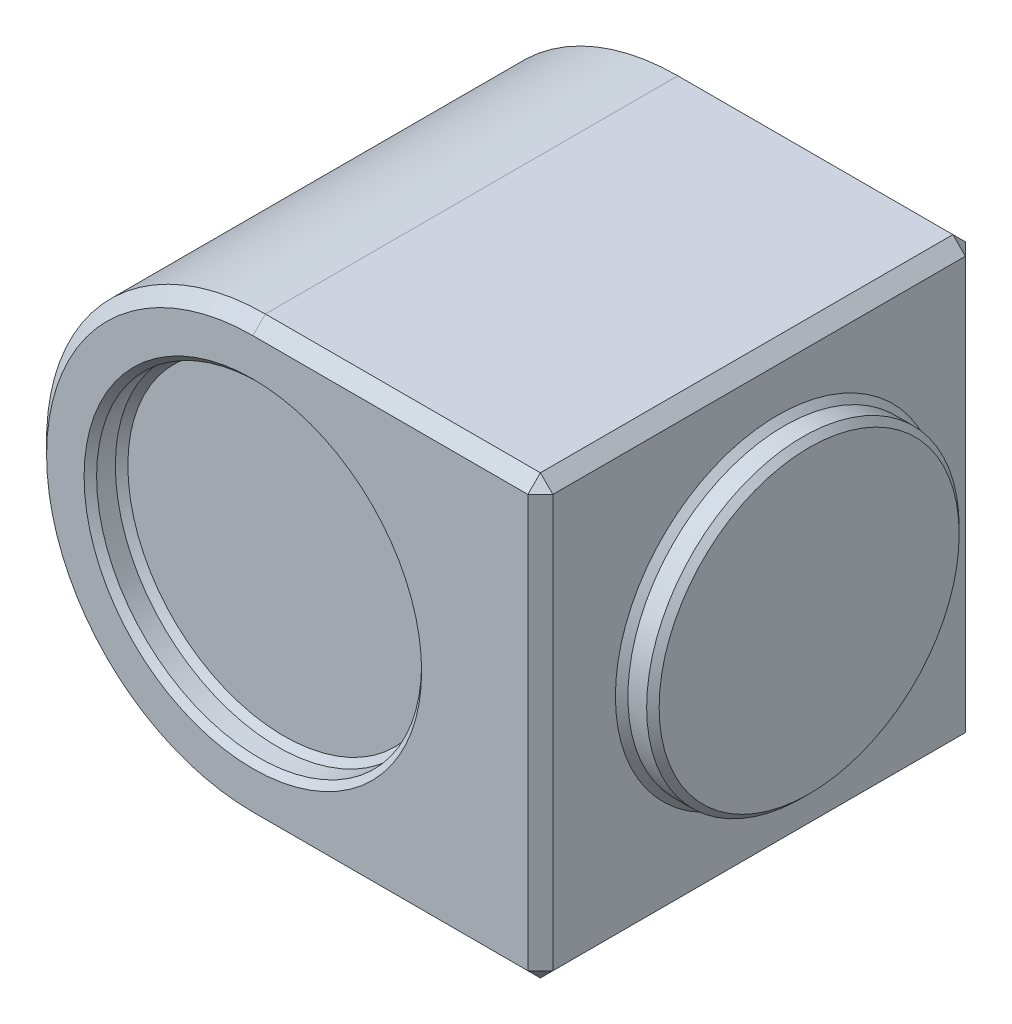
ISO-10303-21;
HEADER;
FILE_DESCRIPTION(('STEP AP214'),'2;1');
FILE_NAME('part.step','',(''),(''),'','','');
FILE_SCHEMA(('AUTOMOTIVE_DESIGN { 1 0 10303 214 1 1 1 1 }'));
ENDSEC;
DATA;
#1=APPLICATION_CONTEXT('core data for automotive mechanical design processes');
#2=APPLICATION_PROTOCOL_DEFINITION('international standard','automotive_design',2000,#1);
#3=PRODUCT_CONTEXT('',#1,'mechanical');
#4=PRODUCT('Part','Part','',(#3));
#5=PRODUCT_RELATED_PRODUCT_CATEGORY('part','',(#4));
#6=PRODUCT_DEFINITION_FORMATION('','',#4);
#7=PRODUCT_DEFINITION_CONTEXT('part definition',#1,'design');
#8=PRODUCT_DEFINITION('design','',#6,#7);
#9=PRODUCT_DEFINITION_SHAPE('','',#8);
#10=(LENGTH_UNIT() NAMED_UNIT(*) SI_UNIT(.MILLI.,.METRE.));
#11=(NAMED_UNIT(*) PLANE_ANGLE_UNIT() SI_UNIT($,.RADIAN.));
#12=(NAMED_UNIT(*) SI_UNIT($,.STERADIAN.) SOLID_ANGLE_UNIT());
#13=UNCERTAINTY_MEASURE_WITH_UNIT(LENGTH_MEASURE(1.E-05),#10,'distance_accuracy_value','');
#14=(GEOMETRIC_REPRESENTATION_CONTEXT(3) GLOBAL_UNCERTAINTY_ASSIGNED_CONTEXT((#13)) GLOBAL_UNIT_ASSIGNED_CONTEXT((#10,
#11,#12)) REPRESENTATION_CONTEXT('',''));
#15=CARTESIAN_POINT('',(0.,0.,0.));
#16=DIRECTION('',(0.,0.,1.));
#17=DIRECTION('',(1.,0.,0.));
#18=AXIS2_PLACEMENT_3D('',#15,#16,#17);
#19=CARTESIAN_POINT('',(0.,0.,-70.));
#20=DIRECTION('',(0.,0.,1.));
#21=DIRECTION('',(-1.,0.,0.));
#22=AXIS2_PLACEMENT_3D('',#19,#20,#21);
#23=CYLINDRICAL_SURFACE('',#22,35.);
#24=DIRECTION('',(0.,0.,1.));
#25=VECTOR('',#24,1.);
#26=CARTESIAN_POINT('',(0.,35.,-70.));
#27=LINE('',#26,#25);
#28=CARTESIAN_POINT('',(0.,35.,-68.));
#29=VERTEX_POINT('',#28);
#30=CARTESIAN_POINT('',(0.,35.,-2.));
#31=VERTEX_POINT('',#30);
#32=EDGE_CURVE('E147',#29,#31,#27,.T.);
#33=ORIENTED_EDGE('',*,*,#32,.F.);
#34=CARTESIAN_POINT('',(0.,0.,-68.));
#35=DIRECTION('',(0.,0.,1.));
#36=DIRECTION('',(1.,0.,0.));
#37=AXIS2_PLACEMENT_3D('',#34,#35,#36);
#38=CIRCLE('',#37,35.);
#39=CARTESIAN_POINT('',(0.,-35.,-68.));
#40=VERTEX_POINT('',#39);
#41=EDGE_CURVE('E116',#40,#29,#38,.F.);
#42=ORIENTED_EDGE('',*,*,#41,.F.);
#43=DIRECTION('',(0.,0.,1.));
#44=VECTOR('',#43,1.);
#45=CARTESIAN_POINT('',(0.,-35.,-70.));
#46=LINE('',#45,#44);
#47=CARTESIAN_POINT('',(0.,-35.,-2.));
#48=VERTEX_POINT('',#47);
#49=EDGE_CURVE('E141',#40,#48,#46,.T.);
#50=ORIENTED_EDGE('',*,*,#49,.T.);
#51=CARTESIAN_POINT('',(0.,0.,-2.));
#52=DIRECTION('',(0.,0.,1.));
#53=DIRECTION('',(1.,0.,0.));
#54=AXIS2_PLACEMENT_3D('',#51,#52,#53);
#55=CIRCLE('',#54,35.);
#56=EDGE_CURVE('E150',#31,#48,#55,.T.);
#57=ORIENTED_EDGE('',*,*,#56,.F.);
#58=EDGE_LOOP('',(#33,#42,#50,#57));
#59=FACE_BOUND('',#58,.T.);
#60=ADVANCED_FACE('F32',(#59),#23,.T.);
#61=CARTESIAN_POINT('',(46.,-35.,-70.));
#62=DIRECTION('',(0.,1.,0.));
#63=DIRECTION('',(-1.,0.,0.));
#64=AXIS2_PLACEMENT_3D('',#61,#62,#63);
#65=PLANE('',#64);
#66=ORIENTED_EDGE('',*,*,#49,.F.);
#67=DIRECTION('',(-1.,0.,0.));
#68=VECTOR('',#67,1.);
#69=CARTESIAN_POINT('',(0.,-35.,-68.));
#70=LINE('',#69,#68);
#71=CARTESIAN_POINT('',(44.,-35.,-68.));
#72=VERTEX_POINT('',#71);
#73=EDGE_CURVE('E128',#72,#40,#70,.T.);
#74=ORIENTED_EDGE('',*,*,#73,.F.);
#75=DIRECTION('',(0.,0.,-1.));
#76=VECTOR('',#75,1.);
#77=CARTESIAN_POINT('',(44.,-35.,-70.));
#78=LINE('',#77,#76);
#79=CARTESIAN_POINT('',(44.,-35.,-2.));
#80=VERTEX_POINT('',#79);
#81=EDGE_CURVE('E137',#80,#72,#78,.T.);
#82=ORIENTED_EDGE('',*,*,#81,.F.);
#83=DIRECTION('',(1.,0.,0.));
#84=VECTOR('',#83,1.);
#85=CARTESIAN_POINT('',(46.,-35.,-2.));
#86=LINE('',#85,#84);
#87=EDGE_CURVE('E136',#48,#80,#86,.T.);
#88=ORIENTED_EDGE('',*,*,#87,.F.);
#89=EDGE_LOOP('',(#66,#74,#82,#88));
#90=FACE_BOUND('',#89,.T.);
#91=ADVANCED_FACE('F142',(#90),#65,.F.);
#92=CARTESIAN_POINT('',(46.,35.,-70.));
#93=DIRECTION('',(-1.,0.,0.));
#94=DIRECTION('',(0.,0.,-1.));
#95=AXIS2_PLACEMENT_3D('',#92,#93,#94);
#96=PLANE('',#95);
#97=CARTESIAN_POINT('',(46.,0.,-38.));
#98=DIRECTION('',(1.,0.,0.));
#99=DIRECTION('',(0.,0.,-1.));
#100=AXIS2_PLACEMENT_3D('',#97,#98,#99);
#101=CIRCLE('',#100,26.);
#102=CARTESIAN_POINT('',(46.,0.,-64.));
#103=VERTEX_POINT('',#102);
#104=EDGE_CURVE('E40',#103,#103,#101,.T.);
#105=ORIENTED_EDGE('',*,*,#104,.F.);
#106=EDGE_LOOP('',(#105));
#107=FACE_BOUND('',#106,.T.);
#108=DIRECTION('',(0.,-1.,0.));
#109=VECTOR('',#108,1.);
#110=CARTESIAN_POINT('',(46.,-35.,-68.));
#111=LINE('',#110,#109);
#112=CARTESIAN_POINT('',(46.,33.,-68.));
#113=VERTEX_POINT('',#112);
#114=CARTESIAN_POINT('',(46.,-33.,-68.));
#115=VERTEX_POINT('',#114);
#116=EDGE_CURVE('E153',#113,#115,#111,.T.);
#117=ORIENTED_EDGE('',*,*,#116,.F.);
#118=DIRECTION('',(0.,0.,-1.));
#119=VECTOR('',#118,1.);
#120=CARTESIAN_POINT('',(46.,33.,-70.));
#121=LINE('',#120,#119);
#122=CARTESIAN_POINT('',(46.,33.,-1.99999999999999));
#123=VERTEX_POINT('',#122);
#124=EDGE_CURVE('E160',#123,#113,#121,.T.);
#125=ORIENTED_EDGE('',*,*,#124,.F.);
#126=DIRECTION('',(0.,1.,0.));
#127=VECTOR('',#126,1.);
#128=CARTESIAN_POINT('',(46.,35.,-1.99999999999999));
#129=LINE('',#128,#127);
#130=CARTESIAN_POINT('',(46.,-33.,-1.99999999999999));
#131=VERTEX_POINT('',#130);
#132=EDGE_CURVE('E162',#131,#123,#129,.T.);
#133=ORIENTED_EDGE('',*,*,#132,.F.);
#134=DIRECTION('',(0.,0.,1.));
#135=VECTOR('',#134,1.);
#136=CARTESIAN_POINT('',(46.,-33.,-70.));
#137=LINE('',#136,#135);
#138=EDGE_CURVE('E165',#115,#131,#137,.T.);
#139=ORIENTED_EDGE('',*,*,#138,.F.);
#140=EDGE_LOOP('',(#117,#125,#133,#139));
#141=FACE_BOUND('',#140,.T.);
#142=ADVANCED_FACE('F226',(#107,#141),#96,.F.);
#143=CARTESIAN_POINT('',(0.,35.,-70.));
#144=DIRECTION('',(0.,-1.,0.));
#145=DIRECTION('',(1.,0.,0.));
#146=AXIS2_PLACEMENT_3D('',#143,#144,#145);
#147=PLANE('',#146);
#148=DIRECTION('',(0.,0.,1.));
#149=VECTOR('',#148,1.);
#150=CARTESIAN_POINT('',(44.,35.,-70.));
#151=LINE('',#150,#149);
#152=CARTESIAN_POINT('',(44.,35.,-68.));
#153=VERTEX_POINT('',#152);
#154=CARTESIAN_POINT('',(44.,35.,-2.));
#155=VERTEX_POINT('',#154);
#156=EDGE_CURVE('E171',#153,#155,#151,.T.);
#157=ORIENTED_EDGE('',*,*,#156,.F.);
#158=DIRECTION('',(1.,0.,0.));
#159=VECTOR('',#158,1.);
#160=CARTESIAN_POINT('',(46.,35.,-68.));
#161=LINE('',#160,#159);
#162=EDGE_CURVE('E168',#29,#153,#161,.T.);
#163=ORIENTED_EDGE('',*,*,#162,.F.);
#164=ORIENTED_EDGE('',*,*,#32,.T.);
#165=DIRECTION('',(-1.,0.,0.));
#166=VECTOR('',#165,1.);
#167=CARTESIAN_POINT('',(0.,35.,-2.));
#168=LINE('',#167,#166);
#169=EDGE_CURVE('E173',#155,#31,#168,.T.);
#170=ORIENTED_EDGE('',*,*,#169,.F.);
#171=EDGE_LOOP('',(#157,#163,#164,#170));
#172=FACE_BOUND('',#171,.T.);
#173=ADVANCED_FACE('F229',(#172),#147,.F.);
#174=CARTESIAN_POINT('',(0.,0.,-70.));
#175=DIRECTION('',(0.,0.,-1.));
#176=DIRECTION('',(1.,0.,0.));
#177=AXIS2_PLACEMENT_3D('',#174,#175,#176);
#178=PLANE('',#177);
#179=CARTESIAN_POINT('',(0.,0.,-70.));
#180=DIRECTION('',(0.,0.,1.));
#181=DIRECTION('',(1.,0.,0.));
#182=AXIS2_PLACEMENT_3D('',#179,#180,#181);
#183=CIRCLE('',#182,33.);
#184=CARTESIAN_POINT('',(0.,33.,-70.));
#185=VERTEX_POINT('',#184);
#186=CARTESIAN_POINT('',(0.,-33.,-70.));
#187=VERTEX_POINT('',#186);
#188=EDGE_CURVE('E119',#185,#187,#183,.T.);
#189=ORIENTED_EDGE('',*,*,#188,.F.);
#190=DIRECTION('',(-1.,0.,0.));
#191=VECTOR('',#190,1.);
#192=CARTESIAN_POINT('',(0.,33.,-70.));
#193=LINE('',#192,#191);
#194=CARTESIAN_POINT('',(44.,33.,-70.));
#195=VERTEX_POINT('',#194);
#196=EDGE_CURVE('E266',#195,#185,#193,.T.);
#197=ORIENTED_EDGE('',*,*,#196,.F.);
#198=DIRECTION('',(0.,1.,0.));
#199=VECTOR('',#198,1.);
#200=CARTESIAN_POINT('',(44.,35.,-70.));
#201=LINE('',#200,#199);
#202=CARTESIAN_POINT('',(44.,-33.,-70.));
#203=VERTEX_POINT('',#202);
#204=EDGE_CURVE('E240',#203,#195,#201,.T.);
#205=ORIENTED_EDGE('',*,*,#204,.F.);
#206=DIRECTION('',(1.,0.,0.));
#207=VECTOR('',#206,1.);
#208=CARTESIAN_POINT('',(46.,-33.,-70.));
#209=LINE('',#208,#207);
#210=EDGE_CURVE('E151',#187,#203,#209,.T.);
#211=ORIENTED_EDGE('',*,*,#210,.F.);
#212=EDGE_LOOP('',(#189,#197,#205,#211));
#213=FACE_BOUND('',#212,.T.);
#214=ADVANCED_FACE('F264',(#213),#178,.T.);
#215=CARTESIAN_POINT('',(0.,0.,0.));
#216=DIRECTION('',(0.,0.,-1.));
#217=DIRECTION('',(1.,0.,0.));
#218=AXIS2_PLACEMENT_3D('',#215,#216,#217);
#219=PLANE('',#218);
#220=CARTESIAN_POINT('',(0.,0.,0.));
#221=DIRECTION('',(0.,0.,1.));
#222=DIRECTION('',(1.,0.,0.));
#223=AXIS2_PLACEMENT_3D('',#220,#221,#222);
#224=CIRCLE('',#223,27.);
#225=CARTESIAN_POINT('',(27.,0.,0.));
#226=VERTEX_POINT('',#225);
#227=EDGE_CURVE('E11',#226,#226,#224,.T.);
#228=ORIENTED_EDGE('',*,*,#227,.F.);
#229=EDGE_LOOP('',(#228));
#230=FACE_BOUND('',#229,.T.);
#231=DIRECTION('',(0.,-1.,0.));
#232=VECTOR('',#231,1.);
#233=CARTESIAN_POINT('',(44.,0.,0.));
#234=LINE('',#233,#232);
#235=CARTESIAN_POINT('',(44.,33.,0.));
#236=VERTEX_POINT('',#235);
#237=CARTESIAN_POINT('',(44.,-33.,0.));
#238=VERTEX_POINT('',#237);
#239=EDGE_CURVE('E255',#236,#238,#234,.T.);
#240=ORIENTED_EDGE('',*,*,#239,.F.);
#241=DIRECTION('',(1.,0.,0.));
#242=VECTOR('',#241,1.);
#243=CARTESIAN_POINT('',(0.,33.,0.));
#244=LINE('',#243,#242);
#245=CARTESIAN_POINT('',(0.,33.,0.));
#246=VERTEX_POINT('',#245);
#247=EDGE_CURVE('E277',#246,#236,#244,.T.);
#248=ORIENTED_EDGE('',*,*,#247,.F.);
#249=CARTESIAN_POINT('',(0.,0.,0.));
#250=DIRECTION('',(0.,0.,1.));
#251=DIRECTION('',(1.,0.,0.));
#252=AXIS2_PLACEMENT_3D('',#249,#250,#251);
#253=CIRCLE('',#252,33.);
#254=CARTESIAN_POINT('',(0.,-33.,0.));
#255=VERTEX_POINT('',#254);
#256=EDGE_CURVE('E273',#255,#246,#253,.F.);
#257=ORIENTED_EDGE('',*,*,#256,.F.);
#258=DIRECTION('',(-1.,0.,0.));
#259=VECTOR('',#258,1.);
#260=CARTESIAN_POINT('',(0.,-33.,0.));
#261=LINE('',#260,#259);
#262=EDGE_CURVE('E268',#238,#255,#261,.T.);
#263=ORIENTED_EDGE('',*,*,#262,.F.);
#264=EDGE_LOOP('',(#240,#248,#257,#263));
#265=FACE_BOUND('',#264,.T.);
#266=ADVANCED_FACE('F480',(#230,#265),#219,.F.);
#267=CARTESIAN_POINT('',(51.,0.,-38.));
#268=DIRECTION('',(-1.,0.,0.));
#269=DIRECTION('',(0.,0.,-1.));
#270=AXIS2_PLACEMENT_3D('',#267,#268,#269);
#271=CYLINDRICAL_SURFACE('',#270,25.);
#272=CARTESIAN_POINT('',(50.,0.,-38.));
#273=DIRECTION('',(-1.,0.,0.));
#274=DIRECTION('',(0.,0.,1.));
#275=AXIS2_PLACEMENT_3D('',#272,#273,#274);
#276=CIRCLE('',#275,25.);
#277=CARTESIAN_POINT('',(50.,0.,-13.));
#278=VERTEX_POINT('',#277);
#279=EDGE_CURVE('E218',#278,#278,#276,.F.);
#280=ORIENTED_EDGE('',*,*,#279,.F.);
#281=EDGE_LOOP('',(#280));
#282=FACE_BOUND('',#281,.T.);
#283=CARTESIAN_POINT('',(47.,0.,-38.));
#284=DIRECTION('',(1.,0.,0.));
#285=DIRECTION('',(0.,0.,-1.));
#286=AXIS2_PLACEMENT_3D('',#283,#284,#285);
#287=CIRCLE('',#286,25.);
#288=CARTESIAN_POINT('',(47.,0.,-63.));
#289=VERTEX_POINT('',#288);
#290=EDGE_CURVE('E215',#289,#289,#287,.F.);
#291=ORIENTED_EDGE('',*,*,#290,.F.);
#292=EDGE_LOOP('',(#291));
#293=FACE_BOUND('',#292,.T.);
#294=ADVANCED_FACE('F293',(#282,#293),#271,.T.);
#295=CARTESIAN_POINT('',(51.,0.,-38.));
#296=DIRECTION('',(1.,0.,0.));
#297=DIRECTION('',(0.,0.,1.));
#298=AXIS2_PLACEMENT_3D('',#295,#296,#297);
#299=PLANE('',#298);
#300=CARTESIAN_POINT('',(51.,0.,-38.));
#301=DIRECTION('',(-1.,0.,0.));
#302=DIRECTION('',(0.,0.,1.));
#303=AXIS2_PLACEMENT_3D('',#300,#301,#302);
#304=CIRCLE('',#303,24.);
#305=CARTESIAN_POINT('',(51.,0.,-14.));
#306=VERTEX_POINT('',#305);
#307=EDGE_CURVE('E212',#306,#306,#304,.T.);
#308=ORIENTED_EDGE('',*,*,#307,.F.);
#309=EDGE_LOOP('',(#308));
#310=FACE_BOUND('',#309,.T.);
#311=ADVANCED_FACE('F286',(#310),#299,.T.);
#312=CARTESIAN_POINT('',(0.,33.,-70.));
#313=DIRECTION('',(0.,0.70710678118655,-0.707106781186545));
#314=DIRECTION('',(1.,0.,0.));
#315=AXIS2_PLACEMENT_3D('',#312,#313,#314);
#316=PLANE('',#315);
#317=DIRECTION('',(0.,-0.707106781186545,-0.70710678118655));
#318=VECTOR('',#317,1.);
#319=CARTESIAN_POINT('',(44.,34.,-69.));
#320=LINE('',#319,#318);
#321=EDGE_CURVE('E123',#153,#195,#320,.T.);
#322=ORIENTED_EDGE('',*,*,#321,.T.);
#323=ORIENTED_EDGE('',*,*,#196,.T.);
#324=DIRECTION('',(0.,0.707106781186545,0.70710678118655));
#325=VECTOR('',#324,1.);
#326=CARTESIAN_POINT('',(0.,33.,-70.));
#327=LINE('',#326,#325);
#328=EDGE_CURVE('E202',#185,#29,#327,.T.);
#329=ORIENTED_EDGE('',*,*,#328,.T.);
#330=ORIENTED_EDGE('',*,*,#162,.T.);
#331=EDGE_LOOP('',(#322,#323,#329,#330));
#332=FACE_BOUND('',#331,.T.);
#333=ADVANCED_FACE('F284',(#332),#316,.T.);
#334=CARTESIAN_POINT('',(0.,0.,-70.));
#335=DIRECTION('',(0.,0.,1.));
#336=DIRECTION('',(-1.,0.,0.));
#337=AXIS2_PLACEMENT_3D('',#334,#335,#336);
#338=CONICAL_SURFACE('',#337,33.,0.785398163397445);
#339=ORIENTED_EDGE('',*,*,#328,.F.);
#340=ORIENTED_EDGE('',*,*,#188,.T.);
#341=DIRECTION('',(0.,-0.707106781186545,0.70710678118655));
#342=VECTOR('',#341,1.);
#343=CARTESIAN_POINT('',(0.,-33.,-70.));
#344=LINE('',#343,#342);
#345=EDGE_CURVE('E112',#187,#40,#344,.T.);
#346=ORIENTED_EDGE('',*,*,#345,.T.);
#347=ORIENTED_EDGE('',*,*,#41,.T.);
#348=EDGE_LOOP('',(#339,#340,#346,#347));
#349=FACE_BOUND('',#348,.T.);
#350=ADVANCED_FACE('F114',(#349),#338,.T.);
#351=CARTESIAN_POINT('',(46.,33.,-68.));
#352=DIRECTION('',(0.577350269189626,0.57735026918963,-0.577350269189622));
#353=DIRECTION('',(-0.70710678118655,0.707106781186545,0.));
#354=AXIS2_PLACEMENT_3D('',#351,#352,#353);
#355=PLANE('',#354);
#356=DIRECTION('',(0.70710678118655,-0.707106781186545,0.));
#357=VECTOR('',#356,1.);
#358=CARTESIAN_POINT('',(46.,33.,-68.));
#359=LINE('',#358,#357);
#360=EDGE_CURVE('E55',#153,#113,#359,.T.);
#361=ORIENTED_EDGE('',*,*,#360,.T.);
#362=DIRECTION('',(0.707106781186545,0.,0.70710678118655));
#363=VECTOR('',#362,1.);
#364=CARTESIAN_POINT('',(46.,33.,-68.));
#365=LINE('',#364,#363);
#366=EDGE_CURVE('E124',#113,#195,#365,.F.);
#367=ORIENTED_EDGE('',*,*,#366,.T.);
#368=ORIENTED_EDGE('',*,*,#321,.F.);
#369=EDGE_LOOP('',(#361,#367,#368));
#370=FACE_BOUND('',#369,.T.);
#371=ADVANCED_FACE('F243',(#370),#355,.T.);
#372=CARTESIAN_POINT('',(0.,-33.,-70.));
#373=DIRECTION('',(0.,-0.70710678118655,-0.707106781186545));
#374=DIRECTION('',(-1.,0.,0.));
#375=AXIS2_PLACEMENT_3D('',#372,#373,#374);
#376=PLANE('',#375);
#377=ORIENTED_EDGE('',*,*,#345,.F.);
#378=ORIENTED_EDGE('',*,*,#210,.T.);
#379=DIRECTION('',(0.,-0.707106781186545,0.70710678118655));
#380=VECTOR('',#379,1.);
#381=CARTESIAN_POINT('',(44.,-33.,-70.));
#382=LINE('',#381,#380);
#383=EDGE_CURVE('E132',#203,#72,#382,.T.);
#384=ORIENTED_EDGE('',*,*,#383,.T.);
#385=ORIENTED_EDGE('',*,*,#73,.T.);
#386=EDGE_LOOP('',(#377,#378,#384,#385));
#387=FACE_BOUND('',#386,.T.);
#388=ADVANCED_FACE('F130',(#387),#376,.T.);
#389=CARTESIAN_POINT('',(44.,0.,-70.));
#390=DIRECTION('',(0.70710678118655,0.,-0.707106781186545));
#391=DIRECTION('',(0.,-1.,0.));
#392=AXIS2_PLACEMENT_3D('',#389,#390,#391);
#393=PLANE('',#392);
#394=ORIENTED_EDGE('',*,*,#366,.F.);
#395=ORIENTED_EDGE('',*,*,#116,.T.);
#396=DIRECTION('',(-0.707106781186545,0.,-0.70710678118655));
#397=VECTOR('',#396,1.);
#398=CARTESIAN_POINT('',(44.,-33.,-70.));
#399=LINE('',#398,#397);
#400=EDGE_CURVE('E195',#115,#203,#399,.T.);
#401=ORIENTED_EDGE('',*,*,#400,.T.);
#402=ORIENTED_EDGE('',*,*,#204,.T.);
#403=EDGE_LOOP('',(#394,#395,#401,#402));
#404=FACE_BOUND('',#403,.T.);
#405=ADVANCED_FACE('F236',(#404),#393,.T.);
#406=CARTESIAN_POINT('',(44.,35.,-70.));
#407=DIRECTION('',(-0.707106781186545,-0.70710678118655,0.));
#408=DIRECTION('',(0.,0.,1.));
#409=AXIS2_PLACEMENT_3D('',#406,#407,#408);
#410=PLANE('',#409);
#411=ORIENTED_EDGE('',*,*,#360,.F.);
#412=ORIENTED_EDGE('',*,*,#156,.T.);
#413=DIRECTION('',(-0.70710678118655,0.707106781186545,0.));
#414=VECTOR('',#413,1.);
#415=CARTESIAN_POINT('',(46.,33.,-1.99999999999999));
#416=LINE('',#415,#414);
#417=EDGE_CURVE('E192',#155,#123,#416,.F.);
#418=ORIENTED_EDGE('',*,*,#417,.T.);
#419=ORIENTED_EDGE('',*,*,#124,.T.);
#420=EDGE_LOOP('',(#411,#412,#418,#419));
#421=FACE_BOUND('',#420,.T.);
#422=ADVANCED_FACE('F244',(#421),#410,.F.);
#423=CARTESIAN_POINT('',(44.,-33.,-70.));
#424=DIRECTION('',(0.577350269189626,-0.57735026918963,-0.577350269189622));
#425=DIRECTION('',(0.70710678118655,0.707106781186545,0.));
#426=AXIS2_PLACEMENT_3D('',#423,#424,#425);
#427=PLANE('',#426);
#428=ORIENTED_EDGE('',*,*,#400,.F.);
#429=DIRECTION('',(-0.70710678118655,-0.707106781186545,0.));
#430=VECTOR('',#429,1.);
#431=CARTESIAN_POINT('',(45.,-34.,-68.));
#432=LINE('',#431,#430);
#433=EDGE_CURVE('E189',#115,#72,#432,.T.);
#434=ORIENTED_EDGE('',*,*,#433,.T.);
#435=ORIENTED_EDGE('',*,*,#383,.F.);
#436=EDGE_LOOP('',(#428,#434,#435));
#437=FACE_BOUND('',#436,.T.);
#438=ADVANCED_FACE('F262',(#437),#427,.T.);
#439=CARTESIAN_POINT('',(46.,33.,-1.99999999999999));
#440=DIRECTION('',(0.577350269189622,0.57735026918963,0.577350269189626));
#441=DIRECTION('',(0.,0.707106781186545,-0.70710678118655));
#442=AXIS2_PLACEMENT_3D('',#439,#440,#441);
#443=PLANE('',#442);
#444=DIRECTION('',(0.70710678118655,0.,-0.707106781186545));
#445=VECTOR('',#444,1.);
#446=CARTESIAN_POINT('',(46.,33.,-1.99999999999999));
#447=LINE('',#446,#445);
#448=EDGE_CURVE('E187',#236,#123,#447,.T.);
#449=ORIENTED_EDGE('',*,*,#448,.T.);
#450=ORIENTED_EDGE('',*,*,#417,.F.);
#451=DIRECTION('',(0.,-0.707106781186545,0.70710678118655));
#452=VECTOR('',#451,1.);
#453=CARTESIAN_POINT('',(44.,34.,-1.));
#454=LINE('',#453,#452);
#455=EDGE_CURVE('E47',#155,#236,#454,.T.);
#456=ORIENTED_EDGE('',*,*,#455,.T.);
#457=EDGE_LOOP('',(#449,#450,#456));
#458=FACE_BOUND('',#457,.T.);
#459=ADVANCED_FACE('F322',(#458),#443,.T.);
#460=CARTESIAN_POINT('',(0.,35.,-2.));
#461=DIRECTION('',(0.,-0.70710678118655,-0.707106781186545));
#462=DIRECTION('',(-1.,0.,0.));
#463=AXIS2_PLACEMENT_3D('',#460,#461,#462);
#464=PLANE('',#463);
#465=ORIENTED_EDGE('',*,*,#455,.F.);
#466=ORIENTED_EDGE('',*,*,#169,.T.);
#467=DIRECTION('',(0.,-0.707106781186545,0.70710678118655));
#468=VECTOR('',#467,1.);
#469=CARTESIAN_POINT('',(0.,35.,-2.));
#470=LINE('',#469,#468);
#471=EDGE_CURVE('E185',#31,#246,#470,.T.);
#472=ORIENTED_EDGE('',*,*,#471,.T.);
#473=ORIENTED_EDGE('',*,*,#247,.T.);
#474=EDGE_LOOP('',(#465,#466,#472,#473));
#475=FACE_BOUND('',#474,.T.);
#476=ADVANCED_FACE('F319',(#475),#464,.F.);
#477=CARTESIAN_POINT('',(46.,-33.,-70.));
#478=DIRECTION('',(-0.707106781186545,0.70710678118655,0.));
#479=DIRECTION('',(0.,0.,1.));
#480=AXIS2_PLACEMENT_3D('',#477,#478,#479);
#481=PLANE('',#480);
#482=ORIENTED_EDGE('',*,*,#433,.F.);
#483=ORIENTED_EDGE('',*,*,#138,.T.);
#484=DIRECTION('',(0.70710678118655,0.707106781186545,0.));
#485=VECTOR('',#484,1.);
#486=CARTESIAN_POINT('',(44.,-35.,-2.));
#487=LINE('',#486,#485);
#488=EDGE_CURVE('E182',#131,#80,#487,.F.);
#489=ORIENTED_EDGE('',*,*,#488,.T.);
#490=ORIENTED_EDGE('',*,*,#81,.T.);
#491=EDGE_LOOP('',(#482,#483,#489,#490));
#492=FACE_BOUND('',#491,.T.);
#493=ADVANCED_FACE('F260',(#492),#481,.F.);
#494=CARTESIAN_POINT('',(46.,35.,-1.99999999999999));
#495=DIRECTION('',(-0.707106781186545,0.,-0.70710678118655));
#496=DIRECTION('',(0.,1.,0.));
#497=AXIS2_PLACEMENT_3D('',#494,#495,#496);
#498=PLANE('',#497);
#499=ORIENTED_EDGE('',*,*,#448,.F.);
#500=ORIENTED_EDGE('',*,*,#239,.T.);
#501=DIRECTION('',(-0.70710678118655,0.,0.707106781186545));
#502=VECTOR('',#501,1.);
#503=CARTESIAN_POINT('',(45.,-33.,-0.999999999999994));
#504=LINE('',#503,#502);
#505=EDGE_CURVE('E180',#238,#131,#504,.F.);
#506=ORIENTED_EDGE('',*,*,#505,.T.);
#507=ORIENTED_EDGE('',*,*,#132,.T.);
#508=EDGE_LOOP('',(#499,#500,#506,#507));
#509=FACE_BOUND('',#508,.T.);
#510=ADVANCED_FACE('F250',(#509),#498,.F.);
#511=CARTESIAN_POINT('',(0.,0.,-2.));
#512=DIRECTION('',(0.,0.,-1.));
#513=DIRECTION('',(1.,0.,0.));
#514=AXIS2_PLACEMENT_3D('',#511,#512,#513);
#515=CONICAL_SURFACE('',#514,35.,0.785398163397445);
#516=ORIENTED_EDGE('',*,*,#471,.F.);
#517=ORIENTED_EDGE('',*,*,#56,.T.);
#518=DIRECTION('',(0.,0.707106781186545,0.70710678118655));
#519=VECTOR('',#518,1.);
#520=CARTESIAN_POINT('',(0.,-35.,-2.));
#521=LINE('',#520,#519);
#522=EDGE_CURVE('E178',#48,#255,#521,.T.);
#523=ORIENTED_EDGE('',*,*,#522,.T.);
#524=ORIENTED_EDGE('',*,*,#256,.T.);
#525=EDGE_LOOP('',(#516,#517,#523,#524));
#526=FACE_BOUND('',#525,.T.);
#527=ADVANCED_FACE('F311',(#526),#515,.T.);
#528=CARTESIAN_POINT('',(44.,-35.,-2.));
#529=DIRECTION('',(0.577350269189622,-0.57735026918963,0.577350269189626));
#530=DIRECTION('',(0.,0.707106781186545,0.70710678118655));
#531=AXIS2_PLACEMENT_3D('',#528,#529,#530);
#532=PLANE('',#531);
#533=ORIENTED_EDGE('',*,*,#505,.F.);
#534=DIRECTION('',(0.,-0.707106781186545,-0.70710678118655));
#535=VECTOR('',#534,1.);
#536=CARTESIAN_POINT('',(44.,-35.,-2.));
#537=LINE('',#536,#535);
#538=EDGE_CURVE('E176',#238,#80,#537,.T.);
#539=ORIENTED_EDGE('',*,*,#538,.T.);
#540=ORIENTED_EDGE('',*,*,#488,.F.);
#541=EDGE_LOOP('',(#533,#539,#540));
#542=FACE_BOUND('',#541,.T.);
#543=ADVANCED_FACE('F258',(#542),#532,.T.);
#544=CARTESIAN_POINT('',(46.,-35.,-2.));
#545=DIRECTION('',(0.,0.70710678118655,-0.707106781186545));
#546=DIRECTION('',(1.,0.,0.));
#547=AXIS2_PLACEMENT_3D('',#544,#545,#546);
#548=PLANE('',#547);
#549=ORIENTED_EDGE('',*,*,#522,.F.);
#550=ORIENTED_EDGE('',*,*,#87,.T.);
#551=ORIENTED_EDGE('',*,*,#538,.F.);
#552=ORIENTED_EDGE('',*,*,#262,.T.);
#553=EDGE_LOOP('',(#549,#550,#551,#552));
#554=FACE_BOUND('',#553,.T.);
#555=ADVANCED_FACE('F304',(#554),#548,.F.);
#556=CARTESIAN_POINT('',(0.,0.,-5.));
#557=DIRECTION('',(0.,0.,1.));
#558=DIRECTION('',(-1.,0.,0.));
#559=AXIS2_PLACEMENT_3D('',#556,#557,#558);
#560=CYLINDRICAL_SURFACE('',#559,26.);
#561=CARTESIAN_POINT('',(0.,0.,-4.));
#562=DIRECTION('',(0.,0.,-1.));
#563=DIRECTION('',(-1.,0.,0.));
#564=AXIS2_PLACEMENT_3D('',#561,#562,#563);
#565=CIRCLE('',#564,26.);
#566=CARTESIAN_POINT('',(-26.,0.,-4.));
#567=VERTEX_POINT('',#566);
#568=EDGE_CURVE('E209',#567,#567,#565,.F.);
#569=ORIENTED_EDGE('',*,*,#568,.F.);
#570=EDGE_LOOP('',(#569));
#571=FACE_BOUND('',#570,.T.);
#572=CARTESIAN_POINT('',(0.,0.,-1.00000000000001));
#573=DIRECTION('',(0.,0.,1.));
#574=DIRECTION('',(1.,0.,0.));
#575=AXIS2_PLACEMENT_3D('',#572,#573,#574);
#576=CIRCLE('',#575,26.);
#577=CARTESIAN_POINT('',(26.,0.,-1.00000000000001));
#578=VERTEX_POINT('',#577);
#579=EDGE_CURVE('E206',#578,#578,#576,.F.);
#580=ORIENTED_EDGE('',*,*,#579,.F.);
#581=EDGE_LOOP('',(#580));
#582=FACE_BOUND('',#581,.T.);
#583=ADVANCED_FACE('F307',(#571,#582),#560,.F.);
#584=CARTESIAN_POINT('',(0.,0.,-5.));
#585=DIRECTION('',(0.,0.,1.));
#586=DIRECTION('',(-1.,0.,0.));
#587=AXIS2_PLACEMENT_3D('',#584,#585,#586);
#588=PLANE('',#587);
#589=CARTESIAN_POINT('',(0.,0.,-5.));
#590=DIRECTION('',(0.,0.,-1.));
#591=DIRECTION('',(-1.,0.,0.));
#592=AXIS2_PLACEMENT_3D('',#589,#590,#591);
#593=CIRCLE('',#592,25.);
#594=CARTESIAN_POINT('',(-25.,0.,-5.));
#595=VERTEX_POINT('',#594);
#596=EDGE_CURVE('E175',#595,#595,#593,.T.);
#597=ORIENTED_EDGE('',*,*,#596,.F.);
#598=EDGE_LOOP('',(#597));
#599=FACE_BOUND('',#598,.T.);
#600=ADVANCED_FACE('F388',(#599),#588,.T.);
#601=CARTESIAN_POINT('',(0.,0.,-5.));
#602=DIRECTION('',(0.,0.,1.));
#603=DIRECTION('',(-1.,0.,0.));
#604=AXIS2_PLACEMENT_3D('',#601,#602,#603);
#605=CONICAL_SURFACE('',#604,25.,0.78539816339745);
#606=ORIENTED_EDGE('',*,*,#568,.T.);
#607=EDGE_LOOP('',(#606));
#608=FACE_BOUND('',#607,.T.);
#609=ORIENTED_EDGE('',*,*,#596,.T.);
#610=EDGE_LOOP('',(#609));
#611=FACE_BOUND('',#610,.T.);
#612=ADVANCED_FACE('F396',(#608,#611),#605,.F.);
#613=CARTESIAN_POINT('',(51.,0.,-38.));
#614=DIRECTION('',(-1.,0.,0.));
#615=DIRECTION('',(0.,0.,-1.));
#616=AXIS2_PLACEMENT_3D('',#613,#614,#615);
#617=CONICAL_SURFACE('',#616,24.,0.785398163397459);
#618=ORIENTED_EDGE('',*,*,#279,.T.);
#619=EDGE_LOOP('',(#618));
#620=FACE_BOUND('',#619,.T.);
#621=ORIENTED_EDGE('',*,*,#307,.T.);
#622=EDGE_LOOP('',(#621));
#623=FACE_BOUND('',#622,.T.);
#624=ADVANCED_FACE('F404',(#620,#623),#617,.T.);
#625=CARTESIAN_POINT('',(47.,0.,-38.));
#626=DIRECTION('',(-1.,0.,0.));
#627=DIRECTION('',(0.,0.,-1.));
#628=AXIS2_PLACEMENT_3D('',#625,#626,#627);
#629=CONICAL_SURFACE('',#628,25.,0.785398163397431);
#630=ORIENTED_EDGE('',*,*,#104,.T.);
#631=EDGE_LOOP('',(#630));
#632=FACE_BOUND('',#631,.T.);
#633=ORIENTED_EDGE('',*,*,#290,.T.);
#634=EDGE_LOOP('',(#633));
#635=FACE_BOUND('',#634,.T.);
#636=ADVANCED_FACE('F223',(#632,#635),#629,.T.);
#637=CARTESIAN_POINT('',(0.,0.,-1.00000000000001));
#638=DIRECTION('',(0.,0.,1.));
#639=DIRECTION('',(-1.,0.,0.));
#640=AXIS2_PLACEMENT_3D('',#637,#638,#639);
#641=CONICAL_SURFACE('',#640,26.,0.785398163397447);
#642=ORIENTED_EDGE('',*,*,#227,.T.);
#643=EDGE_LOOP('',(#642));
#644=FACE_BOUND('',#643,.T.);
#645=ORIENTED_EDGE('',*,*,#579,.T.);
#646=EDGE_LOOP('',(#645));
#647=FACE_BOUND('',#646,.T.);
#648=ADVANCED_FACE('F34',(#644,#647),#641,.F.);
#649=CLOSED_SHELL('',(#60,#91,#142,#173,#214,#266,#294,#311,#333,#350,#371,#388,#405,#422,#438,
#459,#476,#493,#510,#527,#543,#555,#583,#600,#612,#624,#636,#648));
#650=MANIFOLD_SOLID_BREP('B2',#649);
#651=ADVANCED_BREP_SHAPE_REPRESENTATION('',(#18,#650),#14);
#652=SHAPE_DEFINITION_REPRESENTATION(#9,#651);
ENDSEC;
END-ISO-10303-21;
